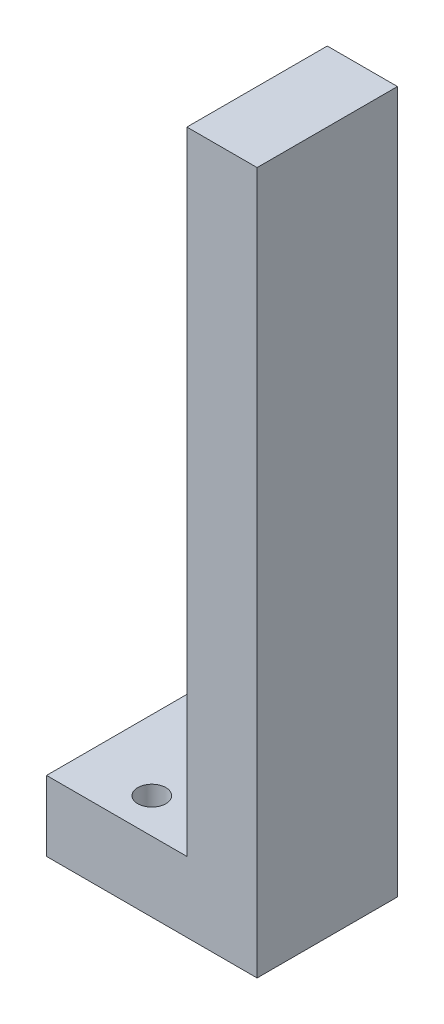
ISO-10303-21;
HEADER;
FILE_DESCRIPTION(('STEP AP214'),'2;1');
FILE_NAME('part.step','',(''),(''),'','','');
FILE_SCHEMA(('AUTOMOTIVE_DESIGN { 1 0 10303 214 1 1 1 1 }'));
ENDSEC;
DATA;
#1=APPLICATION_CONTEXT('core data for automotive mechanical design processes');
#2=APPLICATION_PROTOCOL_DEFINITION('international standard','automotive_design',2000,#1);
#3=PRODUCT_CONTEXT('',#1,'mechanical');
#4=PRODUCT('Part','Part','',(#3));
#5=PRODUCT_RELATED_PRODUCT_CATEGORY('part','',(#4));
#6=PRODUCT_DEFINITION_FORMATION('','',#4);
#7=PRODUCT_DEFINITION_CONTEXT('part definition',#1,'design');
#8=PRODUCT_DEFINITION('design','',#6,#7);
#9=PRODUCT_DEFINITION_SHAPE('','',#8);
#10=(LENGTH_UNIT() NAMED_UNIT(*) SI_UNIT(.MILLI.,.METRE.));
#11=(NAMED_UNIT(*) PLANE_ANGLE_UNIT() SI_UNIT($,.RADIAN.));
#12=(NAMED_UNIT(*) SI_UNIT($,.STERADIAN.) SOLID_ANGLE_UNIT());
#13=UNCERTAINTY_MEASURE_WITH_UNIT(LENGTH_MEASURE(1.E-05),#10,'distance_accuracy_value','');
#14=(GEOMETRIC_REPRESENTATION_CONTEXT(3) GLOBAL_UNCERTAINTY_ASSIGNED_CONTEXT((#13)) GLOBAL_UNIT_ASSIGNED_CONTEXT((#10,
#11,#12)) REPRESENTATION_CONTEXT('',''));
#15=CARTESIAN_POINT('',(0.,0.,0.));
#16=DIRECTION('',(0.,0.,1.));
#17=DIRECTION('',(1.,0.,0.));
#18=AXIS2_PLACEMENT_3D('',#15,#16,#17);
#19=CARTESIAN_POINT('',(-2.5,25.,5.));
#20=DIRECTION('',(1.,0.,0.));
#21=DIRECTION('',(0.,1.,0.));
#22=AXIS2_PLACEMENT_3D('',#19,#20,#21);
#23=PLANE('',#22);
#24=DIRECTION('',(0.,0.,-1.));
#25=VECTOR('',#24,1.);
#26=CARTESIAN_POINT('',(-2.5,-20.,5.));
#27=LINE('',#26,#25);
#28=CARTESIAN_POINT('',(-2.5,-20.,5.));
#29=VERTEX_POINT('',#28);
#30=CARTESIAN_POINT('',(-2.5,-20.,-5.));
#31=VERTEX_POINT('',#30);
#32=EDGE_CURVE('E50',#29,#31,#27,.T.);
#33=ORIENTED_EDGE('',*,*,#32,.F.);
#34=DIRECTION('',(0.,-1.,0.));
#35=VECTOR('',#34,1.);
#36=CARTESIAN_POINT('',(-2.5,25.,5.));
#37=LINE('',#36,#35);
#38=CARTESIAN_POINT('',(-2.5,25.,5.));
#39=VERTEX_POINT('',#38);
#40=EDGE_CURVE('E114',#39,#29,#37,.T.);
#41=ORIENTED_EDGE('',*,*,#40,.F.);
#42=DIRECTION('',(0.,0.,-1.));
#43=VECTOR('',#42,1.);
#44=CARTESIAN_POINT('',(-2.5,25.,5.));
#45=LINE('',#44,#43);
#46=CARTESIAN_POINT('',(-2.5,25.,-5.));
#47=VERTEX_POINT('',#46);
#48=EDGE_CURVE('E59',#39,#47,#45,.T.);
#49=ORIENTED_EDGE('',*,*,#48,.T.);
#50=DIRECTION('',(0.,-1.,0.));
#51=VECTOR('',#50,1.);
#52=CARTESIAN_POINT('',(-2.5,25.,-5.));
#53=LINE('',#52,#51);
#54=EDGE_CURVE('E115',#47,#31,#53,.T.);
#55=ORIENTED_EDGE('',*,*,#54,.T.);
#56=EDGE_LOOP('',(#33,#41,#49,#55));
#57=FACE_BOUND('',#56,.T.);
#58=ADVANCED_FACE('F36',(#57),#23,.F.);
#59=CARTESIAN_POINT('',(-2.5,-25.,5.));
#60=DIRECTION('',(0.,1.,0.));
#61=DIRECTION('',(0.,0.,1.));
#62=AXIS2_PLACEMENT_3D('',#59,#60,#61);
#63=PLANE('',#62);
#64=CARTESIAN_POINT('',(-7.49999999999999,-25.,-2.50000000000001));
#65=DIRECTION('',(0.,1.,0.));
#66=DIRECTION('',(0.,0.,1.));
#67=AXIS2_PLACEMENT_3D('',#64,#65,#66);
#68=CIRCLE('',#67,1.);
#69=CARTESIAN_POINT('',(-7.49999999999999,-25.,-1.50000000000001));
#70=VERTEX_POINT('',#69);
#71=EDGE_CURVE('E143',#70,#70,#68,.T.);
#72=ORIENTED_EDGE('',*,*,#71,.T.);
#73=EDGE_LOOP('',(#72));
#74=FACE_BOUND('',#73,.T.);
#75=CARTESIAN_POINT('',(-7.49999999999999,-25.,2.49999999999999));
#76=DIRECTION('',(0.,1.,0.));
#77=DIRECTION('',(0.,0.,1.));
#78=AXIS2_PLACEMENT_3D('',#75,#76,#77);
#79=CIRCLE('',#78,1.);
#80=CARTESIAN_POINT('',(-7.49999999999999,-25.,3.49999999999999));
#81=VERTEX_POINT('',#80);
#82=EDGE_CURVE('E150',#81,#81,#79,.T.);
#83=ORIENTED_EDGE('',*,*,#82,.T.);
#84=EDGE_LOOP('',(#83));
#85=FACE_BOUND('',#84,.T.);
#86=DIRECTION('',(1.,0.,0.));
#87=VECTOR('',#86,1.);
#88=CARTESIAN_POINT('',(-2.5,-25.,-5.));
#89=LINE('',#88,#87);
#90=CARTESIAN_POINT('',(-12.5,-25.,-5.));
#91=VERTEX_POINT('',#90);
#92=CARTESIAN_POINT('',(2.5,-25.,-5.));
#93=VERTEX_POINT('',#92);
#94=EDGE_CURVE('E117',#91,#93,#89,.T.);
#95=ORIENTED_EDGE('',*,*,#94,.T.);
#96=DIRECTION('',(0.,0.,-1.));
#97=VECTOR('',#96,1.);
#98=CARTESIAN_POINT('',(2.5,-25.,5.));
#99=LINE('',#98,#97);
#100=CARTESIAN_POINT('',(2.5,-25.,5.));
#101=VERTEX_POINT('',#100);
#102=EDGE_CURVE('E11',#101,#93,#99,.T.);
#103=ORIENTED_EDGE('',*,*,#102,.F.);
#104=DIRECTION('',(1.,0.,0.));
#105=VECTOR('',#104,1.);
#106=CARTESIAN_POINT('',(-2.5,-25.,5.));
#107=LINE('',#106,#105);
#108=CARTESIAN_POINT('',(-12.5,-25.,5.));
#109=VERTEX_POINT('',#108);
#110=EDGE_CURVE('E77',#109,#101,#107,.T.);
#111=ORIENTED_EDGE('',*,*,#110,.F.);
#112=DIRECTION('',(0.,0.,1.));
#113=VECTOR('',#112,1.);
#114=CARTESIAN_POINT('',(-12.5,-25.,5.));
#115=LINE('',#114,#113);
#116=EDGE_CURVE('E110',#91,#109,#115,.T.);
#117=ORIENTED_EDGE('',*,*,#116,.F.);
#118=EDGE_LOOP('',(#95,#103,#111,#117));
#119=FACE_BOUND('',#118,.T.);
#120=ADVANCED_FACE('F179',(#74,#85,#119),#63,.F.);
#121=CARTESIAN_POINT('',(2.5,25.,5.));
#122=DIRECTION('',(1.,0.,0.));
#123=DIRECTION('',(0.,1.,0.));
#124=AXIS2_PLACEMENT_3D('',#121,#122,#123);
#125=PLANE('',#124);
#126=DIRECTION('',(0.,-1.,0.));
#127=VECTOR('',#126,1.);
#128=CARTESIAN_POINT('',(2.5,25.,-5.));
#129=LINE('',#128,#127);
#130=CARTESIAN_POINT('',(2.5,25.,-5.));
#131=VERTEX_POINT('',#130);
#132=EDGE_CURVE('E132',#131,#93,#129,.T.);
#133=ORIENTED_EDGE('',*,*,#132,.F.);
#134=DIRECTION('',(0.,0.,-1.));
#135=VECTOR('',#134,1.);
#136=CARTESIAN_POINT('',(2.5,25.,5.));
#137=LINE('',#136,#135);
#138=CARTESIAN_POINT('',(2.5,25.,5.));
#139=VERTEX_POINT('',#138);
#140=EDGE_CURVE('E43',#139,#131,#137,.T.);
#141=ORIENTED_EDGE('',*,*,#140,.F.);
#142=DIRECTION('',(0.,-1.,0.));
#143=VECTOR('',#142,1.);
#144=CARTESIAN_POINT('',(2.5,25.,5.));
#145=LINE('',#144,#143);
#146=EDGE_CURVE('E125',#139,#101,#145,.T.);
#147=ORIENTED_EDGE('',*,*,#146,.T.);
#148=ORIENTED_EDGE('',*,*,#102,.T.);
#149=EDGE_LOOP('',(#133,#141,#147,#148));
#150=FACE_BOUND('',#149,.T.);
#151=ADVANCED_FACE('F140',(#150),#125,.T.);
#152=CARTESIAN_POINT('',(-2.5,25.,5.));
#153=DIRECTION('',(0.,1.,0.));
#154=DIRECTION('',(0.,0.,1.));
#155=AXIS2_PLACEMENT_3D('',#152,#153,#154);
#156=PLANE('',#155);
#157=DIRECTION('',(1.,0.,0.));
#158=VECTOR('',#157,1.);
#159=CARTESIAN_POINT('',(-2.5,25.,-5.));
#160=LINE('',#159,#158);
#161=EDGE_CURVE('E123',#47,#131,#160,.T.);
#162=ORIENTED_EDGE('',*,*,#161,.F.);
#163=ORIENTED_EDGE('',*,*,#48,.F.);
#164=DIRECTION('',(1.,0.,0.));
#165=VECTOR('',#164,1.);
#166=CARTESIAN_POINT('',(-2.5,25.,5.));
#167=LINE('',#166,#165);
#168=EDGE_CURVE('E128',#39,#139,#167,.T.);
#169=ORIENTED_EDGE('',*,*,#168,.T.);
#170=ORIENTED_EDGE('',*,*,#140,.T.);
#171=EDGE_LOOP('',(#162,#163,#169,#170));
#172=FACE_BOUND('',#171,.T.);
#173=ADVANCED_FACE('F138',(#172),#156,.T.);
#174=CARTESIAN_POINT('',(0.,0.,5.));
#175=DIRECTION('',(0.,0.,1.));
#176=DIRECTION('',(1.,0.,0.));
#177=AXIS2_PLACEMENT_3D('',#174,#175,#176);
#178=PLANE('',#177);
#179=ORIENTED_EDGE('',*,*,#40,.T.);
#180=DIRECTION('',(1.,0.,0.));
#181=VECTOR('',#180,1.);
#182=CARTESIAN_POINT('',(-12.5,-20.,5.));
#183=LINE('',#182,#181);
#184=CARTESIAN_POINT('',(-12.5,-20.,5.));
#185=VERTEX_POINT('',#184);
#186=EDGE_CURVE('E98',#185,#29,#183,.T.);
#187=ORIENTED_EDGE('',*,*,#186,.F.);
#188=DIRECTION('',(0.,1.,0.));
#189=VECTOR('',#188,1.);
#190=CARTESIAN_POINT('',(-12.5,-25.,5.));
#191=LINE('',#190,#189);
#192=EDGE_CURVE('E105',#109,#185,#191,.T.);
#193=ORIENTED_EDGE('',*,*,#192,.F.);
#194=ORIENTED_EDGE('',*,*,#110,.T.);
#195=ORIENTED_EDGE('',*,*,#146,.F.);
#196=ORIENTED_EDGE('',*,*,#168,.F.);
#197=EDGE_LOOP('',(#179,#187,#193,#194,#195,#196));
#198=FACE_BOUND('',#197,.T.);
#199=ADVANCED_FACE('F112',(#198),#178,.T.);
#200=CARTESIAN_POINT('',(0.,0.,-5.));
#201=DIRECTION('',(0.,0.,1.));
#202=DIRECTION('',(1.,0.,0.));
#203=AXIS2_PLACEMENT_3D('',#200,#201,#202);
#204=PLANE('',#203);
#205=ORIENTED_EDGE('',*,*,#54,.F.);
#206=ORIENTED_EDGE('',*,*,#161,.T.);
#207=ORIENTED_EDGE('',*,*,#132,.T.);
#208=ORIENTED_EDGE('',*,*,#94,.F.);
#209=DIRECTION('',(0.,-1.,0.));
#210=VECTOR('',#209,1.);
#211=CARTESIAN_POINT('',(-12.5,-25.,-5.));
#212=LINE('',#211,#210);
#213=CARTESIAN_POINT('',(-12.5,-20.,-5.));
#214=VERTEX_POINT('',#213);
#215=EDGE_CURVE('E104',#214,#91,#212,.T.);
#216=ORIENTED_EDGE('',*,*,#215,.F.);
#217=DIRECTION('',(1.,0.,0.));
#218=VECTOR('',#217,1.);
#219=CARTESIAN_POINT('',(-12.5,-20.,-5.));
#220=LINE('',#219,#218);
#221=EDGE_CURVE('E100',#214,#31,#220,.T.);
#222=ORIENTED_EDGE('',*,*,#221,.T.);
#223=EDGE_LOOP('',(#205,#206,#207,#208,#216,#222));
#224=FACE_BOUND('',#223,.T.);
#225=ADVANCED_FACE('F142',(#224),#204,.F.);
#226=CARTESIAN_POINT('',(-12.5,-20.,5.));
#227=DIRECTION('',(0.,-1.,0.));
#228=DIRECTION('',(0.,0.,-1.));
#229=AXIS2_PLACEMENT_3D('',#226,#227,#228);
#230=PLANE('',#229);
#231=CARTESIAN_POINT('',(-7.5,-20.,-2.50000000000001));
#232=DIRECTION('',(0.,1.,0.));
#233=DIRECTION('',(0.,0.,1.));
#234=AXIS2_PLACEMENT_3D('',#231,#232,#233);
#235=CIRCLE('',#234,1.);
#236=CARTESIAN_POINT('',(-7.5,-20.,-1.50000000000001));
#237=VERTEX_POINT('',#236);
#238=EDGE_CURVE('E145',#237,#237,#235,.T.);
#239=ORIENTED_EDGE('',*,*,#238,.F.);
#240=EDGE_LOOP('',(#239));
#241=FACE_BOUND('',#240,.T.);
#242=CARTESIAN_POINT('',(-7.5,-20.,2.49999999999999));
#243=DIRECTION('',(0.,1.,0.));
#244=DIRECTION('',(0.,0.,1.));
#245=AXIS2_PLACEMENT_3D('',#242,#243,#244);
#246=CIRCLE('',#245,1.);
#247=CARTESIAN_POINT('',(-7.5,-20.,3.49999999999999));
#248=VERTEX_POINT('',#247);
#249=EDGE_CURVE('E153',#248,#248,#246,.T.);
#250=ORIENTED_EDGE('',*,*,#249,.F.);
#251=EDGE_LOOP('',(#250));
#252=FACE_BOUND('',#251,.T.);
#253=ORIENTED_EDGE('',*,*,#32,.T.);
#254=ORIENTED_EDGE('',*,*,#221,.F.);
#255=DIRECTION('',(0.,0.,-1.));
#256=VECTOR('',#255,1.);
#257=CARTESIAN_POINT('',(-12.5,-20.,5.));
#258=LINE('',#257,#256);
#259=EDGE_CURVE('E94',#185,#214,#258,.T.);
#260=ORIENTED_EDGE('',*,*,#259,.F.);
#261=ORIENTED_EDGE('',*,*,#186,.T.);
#262=EDGE_LOOP('',(#253,#254,#260,#261));
#263=FACE_BOUND('',#262,.T.);
#264=ADVANCED_FACE('F96',(#241,#252,#263),#230,.F.);
#265=CARTESIAN_POINT('',(-12.5,0.,0.));
#266=DIRECTION('',(-1.,0.,0.));
#267=DIRECTION('',(0.,-1.,0.));
#268=AXIS2_PLACEMENT_3D('',#265,#266,#267);
#269=PLANE('',#268);
#270=ORIENTED_EDGE('',*,*,#192,.T.);
#271=ORIENTED_EDGE('',*,*,#259,.T.);
#272=ORIENTED_EDGE('',*,*,#215,.T.);
#273=ORIENTED_EDGE('',*,*,#116,.T.);
#274=EDGE_LOOP('',(#270,#271,#272,#273));
#275=FACE_BOUND('',#274,.T.);
#276=ADVANCED_FACE('F108',(#275),#269,.T.);
#277=CARTESIAN_POINT('',(-7.49999999999999,-25.,2.49999999999999));
#278=DIRECTION('',(0.,1.,0.));
#279=DIRECTION('',(0.,0.,1.));
#280=AXIS2_PLACEMENT_3D('',#277,#278,#279);
#281=CYLINDRICAL_SURFACE('',#280,1.);
#282=ORIENTED_EDGE('',*,*,#82,.F.);
#283=EDGE_LOOP('',(#282));
#284=FACE_BOUND('',#283,.T.);
#285=ORIENTED_EDGE('',*,*,#249,.T.);
#286=EDGE_LOOP('',(#285));
#287=FACE_BOUND('',#286,.T.);
#288=ADVANCED_FACE('F166',(#284,#287),#281,.F.);
#289=CARTESIAN_POINT('',(-7.49999999999999,-25.,-2.50000000000001));
#290=DIRECTION('',(0.,1.,0.));
#291=DIRECTION('',(0.,0.,1.));
#292=AXIS2_PLACEMENT_3D('',#289,#290,#291);
#293=CYLINDRICAL_SURFACE('',#292,1.);
#294=ORIENTED_EDGE('',*,*,#71,.F.);
#295=EDGE_LOOP('',(#294));
#296=FACE_BOUND('',#295,.T.);
#297=ORIENTED_EDGE('',*,*,#238,.T.);
#298=EDGE_LOOP('',(#297));
#299=FACE_BOUND('',#298,.T.);
#300=ADVANCED_FACE('F159',(#296,#299),#293,.F.);
#301=CLOSED_SHELL('',(#58,#120,#151,#173,#199,#225,#264,#276,#288,#300));
#302=MANIFOLD_SOLID_BREP('B2',#301);
#303=ADVANCED_BREP_SHAPE_REPRESENTATION('',(#18,#302),#14);
#304=SHAPE_DEFINITION_REPRESENTATION(#9,#303);
ENDSEC;
END-ISO-10303-21;
